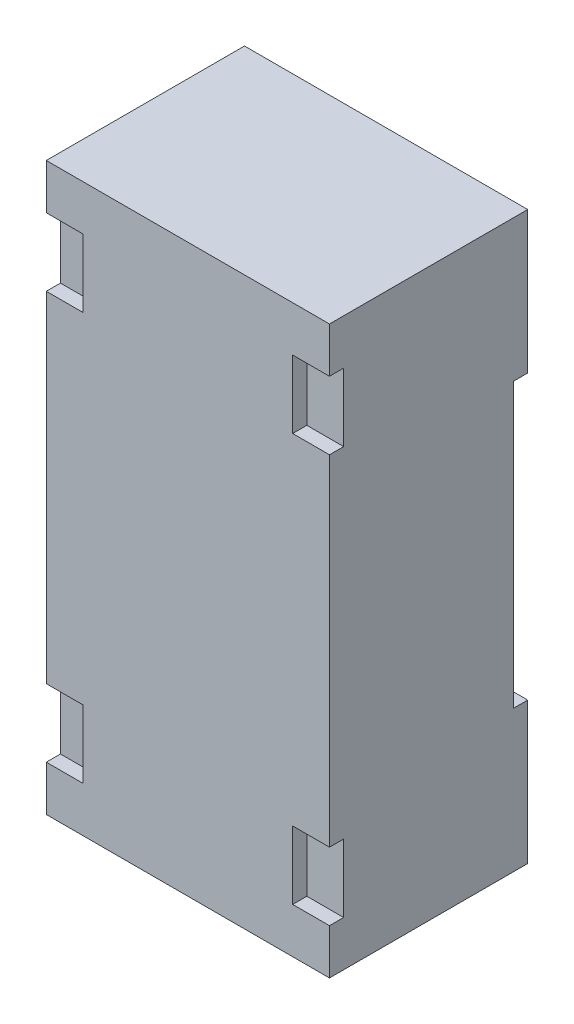
ISO-10303-21;
HEADER;
FILE_DESCRIPTION(('STEP AP214'),'2;1');
FILE_NAME('part.step','',(''),(''),'','','');
FILE_SCHEMA(('AUTOMOTIVE_DESIGN { 1 0 10303 214 1 1 1 1 }'));
ENDSEC;
DATA;
#1=APPLICATION_CONTEXT('core data for automotive mechanical design processes');
#2=APPLICATION_PROTOCOL_DEFINITION('international standard','automotive_design',2000,#1);
#3=PRODUCT_CONTEXT('',#1,'mechanical');
#4=PRODUCT('Part','Part','',(#3));
#5=PRODUCT_RELATED_PRODUCT_CATEGORY('part','',(#4));
#6=PRODUCT_DEFINITION_FORMATION('','',#4);
#7=PRODUCT_DEFINITION_CONTEXT('part definition',#1,'design');
#8=PRODUCT_DEFINITION('design','',#6,#7);
#9=PRODUCT_DEFINITION_SHAPE('','',#8);
#10=(LENGTH_UNIT() NAMED_UNIT(*) SI_UNIT(.MILLI.,.METRE.));
#11=(NAMED_UNIT(*) PLANE_ANGLE_UNIT() SI_UNIT($,.RADIAN.));
#12=(NAMED_UNIT(*) SI_UNIT($,.STERADIAN.) SOLID_ANGLE_UNIT());
#13=UNCERTAINTY_MEASURE_WITH_UNIT(LENGTH_MEASURE(1.E-05),#10,'distance_accuracy_value','');
#14=(GEOMETRIC_REPRESENTATION_CONTEXT(3) GLOBAL_UNCERTAINTY_ASSIGNED_CONTEXT((#13)) GLOBAL_UNIT_ASSIGNED_CONTEXT((#10,
#11,#12)) REPRESENTATION_CONTEXT('',''));
#15=CARTESIAN_POINT('',(0.,0.,0.));
#16=DIRECTION('',(0.,0.,1.));
#17=DIRECTION('',(1.,0.,0.));
#18=AXIS2_PLACEMENT_3D('',#15,#16,#17);
#19=CARTESIAN_POINT('',(14.117799072266,24.598000488281,1.501800003052));
#20=DIRECTION('',(0.,0.,-1.));
#21=DIRECTION('',(0.,-1.,0.));
#22=AXIS2_PLACEMENT_3D('',#19,#20,#21);
#23=PLANE('',#22);
#24=DIRECTION('',(0.,1.,0.));
#25=VECTOR('',#24,1.);
#26=CARTESIAN_POINT('',(14.617799072266,26.061125098144,1.501800003052));
#27=LINE('',#26,#25);
#28=CARTESIAN_POINT('',(14.617799072266,24.653000488281,1.501800003052));
#29=VERTEX_POINT('',#28);
#30=CARTESIAN_POINT('',(14.617799072266,24.773000488281,1.501800003052));
#31=VERTEX_POINT('',#30);
#32=EDGE_CURVE('E326',#29,#31,#27,.T.);
#33=ORIENTED_EDGE('',*,*,#32,.T.);
#34=DIRECTION('',(-1.,0.,0.));
#35=VECTOR('',#34,1.);
#36=CARTESIAN_POINT('',(14.617799072266,24.773000488281,1.501800003052));
#37=LINE('',#36,#35);
#38=CARTESIAN_POINT('',(14.552799072266,24.773000488281,1.501800003052));
#39=VERTEX_POINT('',#38);
#40=EDGE_CURVE('E247',#31,#39,#37,.T.);
#41=ORIENTED_EDGE('',*,*,#40,.T.);
#42=DIRECTION('',(0.,-1.,0.));
#43=VECTOR('',#42,1.);
#44=CARTESIAN_POINT('',(14.552799072266,24.773000488281,1.501800003052));
#45=LINE('',#44,#43);
#46=CARTESIAN_POINT('',(14.552799072266,24.653000488281,1.501800003052));
#47=VERTEX_POINT('',#46);
#48=EDGE_CURVE('E282',#39,#47,#45,.T.);
#49=ORIENTED_EDGE('',*,*,#48,.T.);
#50=DIRECTION('',(1.,0.,0.));
#51=VECTOR('',#50,1.);
#52=CARTESIAN_POINT('',(14.617799072266,24.653000488281,1.501800003052));
#53=LINE('',#52,#51);
#54=EDGE_CURVE('E274',#47,#29,#53,.T.);
#55=ORIENTED_EDGE('',*,*,#54,.T.);
#56=EDGE_LOOP('',(#33,#41,#49,#55));
#57=FACE_BOUND('',#56,.T.);
#58=ADVANCED_FACE('F17',(#57),#23,.F.);
#59=CARTESIAN_POINT('',(14.117799072266,24.598000488281,1.501800003052));
#60=DIRECTION('',(0.,0.,-1.));
#61=DIRECTION('',(0.,-1.,0.));
#62=AXIS2_PLACEMENT_3D('',#59,#60,#61);
#63=PLANE('',#62);
#64=DIRECTION('',(0.,1.,0.));
#65=VECTOR('',#64,1.);
#66=CARTESIAN_POINT('',(14.617799072266,26.061125098144,1.501800003052));
#67=LINE('',#66,#65);
#68=CARTESIAN_POINT('',(14.617799072266,25.373000488272,1.501800003052));
#69=VERTEX_POINT('',#68);
#70=CARTESIAN_POINT('',(14.617799072266,25.493000488281,1.501800003052));
#71=VERTEX_POINT('',#70);
#72=EDGE_CURVE('E334',#69,#71,#67,.T.);
#73=ORIENTED_EDGE('',*,*,#72,.T.);
#74=DIRECTION('',(-1.,0.,0.));
#75=VECTOR('',#74,1.);
#76=CARTESIAN_POINT('',(14.617799072266,25.493000488281,1.501800003052));
#77=LINE('',#76,#75);
#78=CARTESIAN_POINT('',(14.552799072266,25.493000488281,1.501800003052));
#79=VERTEX_POINT('',#78);
#80=EDGE_CURVE('E42',#71,#79,#77,.T.);
#81=ORIENTED_EDGE('',*,*,#80,.T.);
#82=DIRECTION('',(0.,-1.,0.));
#83=VECTOR('',#82,1.);
#84=CARTESIAN_POINT('',(14.552799072266,25.373000488281,1.501800003052));
#85=LINE('',#84,#83);
#86=CARTESIAN_POINT('',(14.552799072266,25.373000488277,1.501800003052));
#87=VERTEX_POINT('',#86);
#88=EDGE_CURVE('E377',#79,#87,#85,.T.);
#89=ORIENTED_EDGE('',*,*,#88,.T.);
#90=DIRECTION('',(-1.,0.,0.));
#91=VECTOR('',#90,1.);
#92=CARTESIAN_POINT('',(14.617799072266,25.373000488281,1.501800003052));
#93=LINE('',#92,#91);
#94=EDGE_CURVE('E289',#69,#87,#93,.T.);
#95=ORIENTED_EDGE('',*,*,#94,.F.);
#96=EDGE_LOOP('',(#73,#81,#89,#95));
#97=FACE_BOUND('',#96,.T.);
#98=ADVANCED_FACE('F587',(#97),#63,.F.);
#99=CARTESIAN_POINT('',(14.617799072266,25.573000488281,1.176800003052));
#100=DIRECTION('',(0.,0.,1.));
#101=DIRECTION('',(0.,-1.,0.));
#102=AXIS2_PLACEMENT_3D('',#99,#100,#101);
#103=PLANE('',#102);
#104=DIRECTION('',(0.,1.,0.));
#105=VECTOR('',#104,1.);
#106=CARTESIAN_POINT('',(14.117799072266,26.061125098144,1.176800003052));
#107=LINE('',#106,#105);
#108=CARTESIAN_POINT('',(14.117799072266,25.323000488281,1.176800003052));
#109=VERTEX_POINT('',#108);
#110=CARTESIAN_POINT('',(14.117799072266,25.573000488281,1.176800003052));
#111=VERTEX_POINT('',#110);
#112=EDGE_CURVE('E223',#109,#111,#107,.T.);
#113=ORIENTED_EDGE('',*,*,#112,.T.);
#114=DIRECTION('',(-1.,0.,0.));
#115=VECTOR('',#114,1.);
#116=CARTESIAN_POINT('',(14.617799072266,25.573000488281,1.176800003052));
#117=LINE('',#116,#115);
#118=CARTESIAN_POINT('',(14.617799072266,25.573000488281,1.176800003052));
#119=VERTEX_POINT('',#118);
#120=EDGE_CURVE('E118',#119,#111,#117,.T.);
#121=ORIENTED_EDGE('',*,*,#120,.F.);
#122=DIRECTION('',(0.,-1.,0.));
#123=VECTOR('',#122,1.);
#124=CARTESIAN_POINT('',(14.617799072266,26.061125098144,1.176800003052));
#125=LINE('',#124,#123);
#126=CARTESIAN_POINT('',(14.617799072266,25.323000488281,1.176800003052));
#127=VERTEX_POINT('',#126);
#128=EDGE_CURVE('E333',#119,#127,#125,.T.);
#129=ORIENTED_EDGE('',*,*,#128,.T.);
#130=DIRECTION('',(1.,0.,0.));
#131=VECTOR('',#130,1.);
#132=CARTESIAN_POINT('',(14.367799072266,25.323000488281,1.176800003052));
#133=LINE('',#132,#131);
#134=EDGE_CURVE('E133',#109,#127,#133,.T.);
#135=ORIENTED_EDGE('',*,*,#134,.F.);
#136=EDGE_LOOP('',(#113,#121,#129,#135));
#137=FACE_BOUND('',#136,.T.);
#138=ADVANCED_FACE('F224',(#137),#103,.F.);
#139=CARTESIAN_POINT('',(14.117799072266,24.598000488281,1.501800003052));
#140=DIRECTION('',(0.,0.,-1.));
#141=DIRECTION('',(0.,-1.,0.));
#142=AXIS2_PLACEMENT_3D('',#139,#140,#141);
#143=PLANE('',#142);
#144=DIRECTION('',(0.,1.,0.));
#145=VECTOR('',#144,1.);
#146=CARTESIAN_POINT('',(14.182799072266,24.773000488281,1.501800003052));
#147=LINE('',#146,#145);
#148=CARTESIAN_POINT('',(14.182799072266,24.653000488281,1.501800003052));
#149=VERTEX_POINT('',#148);
#150=CARTESIAN_POINT('',(14.182799072266,24.773000488281,1.501800003052));
#151=VERTEX_POINT('',#150);
#152=EDGE_CURVE('E258',#149,#151,#147,.T.);
#153=ORIENTED_EDGE('',*,*,#152,.T.);
#154=DIRECTION('',(-1.,0.,0.));
#155=VECTOR('',#154,1.);
#156=CARTESIAN_POINT('',(14.617799072266,24.773000488281,1.501800003052));
#157=LINE('',#156,#155);
#158=CARTESIAN_POINT('',(14.117799072266,24.773000488281,1.501800003052));
#159=VERTEX_POINT('',#158);
#160=EDGE_CURVE('E297',#151,#159,#157,.T.);
#161=ORIENTED_EDGE('',*,*,#160,.T.);
#162=DIRECTION('',(0.,-1.,0.));
#163=VECTOR('',#162,1.);
#164=CARTESIAN_POINT('',(14.117799072266,26.061125098144,1.501800003052));
#165=LINE('',#164,#163);
#166=CARTESIAN_POINT('',(14.117799072266,24.653000488281,1.501800003052));
#167=VERTEX_POINT('',#166);
#168=EDGE_CURVE('E396',#159,#167,#165,.T.);
#169=ORIENTED_EDGE('',*,*,#168,.T.);
#170=DIRECTION('',(1.,0.,0.));
#171=VECTOR('',#170,1.);
#172=CARTESIAN_POINT('',(14.117799072266,24.653000488281,1.501800003052));
#173=LINE('',#172,#171);
#174=EDGE_CURVE('E21',#167,#149,#173,.T.);
#175=ORIENTED_EDGE('',*,*,#174,.T.);
#176=EDGE_LOOP('',(#153,#161,#169,#175));
#177=FACE_BOUND('',#176,.T.);
#178=ADVANCED_FACE('F19',(#177),#143,.F.);
#179=CARTESIAN_POINT('',(14.617799072266,24.573000488281,1.176800003052));
#180=DIRECTION('',(0.,0.,1.));
#181=DIRECTION('',(1.,0.,0.));
#182=AXIS2_PLACEMENT_3D('',#179,#180,#181);
#183=PLANE('',#182);
#184=DIRECTION('',(0.,-1.,0.));
#185=VECTOR('',#184,1.);
#186=CARTESIAN_POINT('',(14.617799072266,26.061125098144,1.176800003052));
#187=LINE('',#186,#185);
#188=CARTESIAN_POINT('',(14.617799072266,24.823000488281,1.176800003052));
#189=VERTEX_POINT('',#188);
#190=CARTESIAN_POINT('',(14.617799072266,24.573000488281,1.176800003052));
#191=VERTEX_POINT('',#190);
#192=EDGE_CURVE('E253',#189,#191,#187,.T.);
#193=ORIENTED_EDGE('',*,*,#192,.T.);
#194=DIRECTION('',(1.,0.,0.));
#195=VECTOR('',#194,1.);
#196=CARTESIAN_POINT('',(14.617799072266,24.573000488281,1.176800003052));
#197=LINE('',#196,#195);
#198=CARTESIAN_POINT('',(14.117799072266,24.573000488281,1.176800003052));
#199=VERTEX_POINT('',#198);
#200=EDGE_CURVE('E420',#199,#191,#197,.T.);
#201=ORIENTED_EDGE('',*,*,#200,.F.);
#202=DIRECTION('',(0.,1.,0.));
#203=VECTOR('',#202,1.);
#204=CARTESIAN_POINT('',(14.117799072266,26.061125098144,1.176800003052));
#205=LINE('',#204,#203);
#206=CARTESIAN_POINT('',(14.117799072266,24.823000488281,1.176800003052));
#207=VERTEX_POINT('',#206);
#208=EDGE_CURVE('E321',#199,#207,#205,.T.);
#209=ORIENTED_EDGE('',*,*,#208,.T.);
#210=DIRECTION('',(-1.,0.,0.));
#211=VECTOR('',#210,1.);
#212=CARTESIAN_POINT('',(14.367799072266,24.823000488281,1.176800003052));
#213=LINE('',#212,#211);
#214=EDGE_CURVE('E11',#189,#207,#213,.T.);
#215=ORIENTED_EDGE('',*,*,#214,.F.);
#216=EDGE_LOOP('',(#193,#201,#209,#215));
#217=FACE_BOUND('',#216,.T.);
#218=ADVANCED_FACE('F555',(#217),#183,.F.);
#219=CARTESIAN_POINT('',(14.367799072266,24.823000488281,1.189300003052));
#220=DIRECTION('',(0.,1.,0.));
#221=DIRECTION('',(1.,0.,0.));
#222=AXIS2_PLACEMENT_3D('',#219,#220,#221);
#223=PLANE('',#222);
#224=DIRECTION('',(0.,0.,1.));
#225=VECTOR('',#224,1.);
#226=CARTESIAN_POINT('',(14.117799072266,24.823000488281,1.526800003052));
#227=LINE('',#226,#225);
#228=CARTESIAN_POINT('',(14.117799072266,24.823000488281,1.201800003052));
#229=VERTEX_POINT('',#228);
#230=EDGE_CURVE('E310',#207,#229,#227,.T.);
#231=ORIENTED_EDGE('',*,*,#230,.T.);
#232=DIRECTION('',(1.,0.,0.));
#233=VECTOR('',#232,1.);
#234=CARTESIAN_POINT('',(14.117799072266,24.823000488281,1.201800003052));
#235=LINE('',#234,#233);
#236=CARTESIAN_POINT('',(14.617799072266,24.823000488281,1.201800003052));
#237=VERTEX_POINT('',#236);
#238=EDGE_CURVE('E28',#229,#237,#235,.T.);
#239=ORIENTED_EDGE('',*,*,#238,.T.);
#240=DIRECTION('',(0.,0.,-1.));
#241=VECTOR('',#240,1.);
#242=CARTESIAN_POINT('',(14.617799072266,24.823000488281,1.501800003052));
#243=LINE('',#242,#241);
#244=EDGE_CURVE('E248',#237,#189,#243,.T.);
#245=ORIENTED_EDGE('',*,*,#244,.T.);
#246=ORIENTED_EDGE('',*,*,#214,.T.);
#247=EDGE_LOOP('',(#231,#239,#245,#246));
#248=FACE_BOUND('',#247,.T.);
#249=ADVANCED_FACE('F551',(#248),#223,.T.);
#250=CARTESIAN_POINT('',(14.117799072266,24.598000488281,1.201800003052));
#251=DIRECTION('',(0.,0.,1.));
#252=DIRECTION('',(1.,0.,0.));
#253=AXIS2_PLACEMENT_3D('',#250,#251,#252);
#254=PLANE('',#253);
#255=DIRECTION('',(0.,1.,0.));
#256=VECTOR('',#255,1.);
#257=CARTESIAN_POINT('',(14.117799072266,26.061125098144,1.201800003052));
#258=LINE('',#257,#256);
#259=CARTESIAN_POINT('',(14.117799072266,25.323000488281,1.201800003052));
#260=VERTEX_POINT('',#259);
#261=EDGE_CURVE('E306',#229,#260,#258,.T.);
#262=ORIENTED_EDGE('',*,*,#261,.T.);
#263=DIRECTION('',(-1.,0.,0.));
#264=VECTOR('',#263,1.);
#265=CARTESIAN_POINT('',(14.367799072266,25.323000488281,1.201800003052));
#266=LINE('',#265,#264);
#267=CARTESIAN_POINT('',(14.617799072266,25.323000488281,1.201800003052));
#268=VERTEX_POINT('',#267);
#269=EDGE_CURVE('E256',#268,#260,#266,.T.);
#270=ORIENTED_EDGE('',*,*,#269,.F.);
#271=DIRECTION('',(0.,-1.,0.));
#272=VECTOR('',#271,1.);
#273=CARTESIAN_POINT('',(14.617799072266,26.061125098144,1.201800003052));
#274=LINE('',#273,#272);
#275=EDGE_CURVE('E252',#268,#237,#274,.T.);
#276=ORIENTED_EDGE('',*,*,#275,.T.);
#277=ORIENTED_EDGE('',*,*,#238,.F.);
#278=EDGE_LOOP('',(#262,#270,#276,#277));
#279=FACE_BOUND('',#278,.T.);
#280=ADVANCED_FACE('F549',(#279),#254,.F.);
#281=CARTESIAN_POINT('',(14.367799072266,25.323000488281,1.189300003052));
#282=DIRECTION('',(0.,-1.,0.));
#283=DIRECTION('',(-1.,0.,0.));
#284=AXIS2_PLACEMENT_3D('',#281,#282,#283);
#285=PLANE('',#284);
#286=DIRECTION('',(0.,0.,-1.));
#287=VECTOR('',#286,1.);
#288=CARTESIAN_POINT('',(14.117799072266,25.323000488281,1.526800003052));
#289=LINE('',#288,#287);
#290=EDGE_CURVE('E228',#260,#109,#289,.T.);
#291=ORIENTED_EDGE('',*,*,#290,.T.);
#292=ORIENTED_EDGE('',*,*,#134,.T.);
#293=DIRECTION('',(0.,0.,1.));
#294=VECTOR('',#293,1.);
#295=CARTESIAN_POINT('',(14.617799072266,25.323000488281,1.501800003052));
#296=LINE('',#295,#294);
#297=EDGE_CURVE('E301',#127,#268,#296,.T.);
#298=ORIENTED_EDGE('',*,*,#297,.T.);
#299=ORIENTED_EDGE('',*,*,#269,.T.);
#300=EDGE_LOOP('',(#291,#292,#298,#299));
#301=FACE_BOUND('',#300,.T.);
#302=ADVANCED_FACE('F546',(#301),#285,.T.);
#303=CARTESIAN_POINT('',(14.117799072266,24.598000488281,1.501800003052));
#304=DIRECTION('',(0.,0.,-1.));
#305=DIRECTION('',(0.,-1.,0.));
#306=AXIS2_PLACEMENT_3D('',#303,#304,#305);
#307=PLANE('',#306);
#308=DIRECTION('',(0.,1.,0.));
#309=VECTOR('',#308,1.);
#310=CARTESIAN_POINT('',(14.182799072266,25.373000488281,1.501800003052));
#311=LINE('',#310,#309);
#312=CARTESIAN_POINT('',(14.182799072266,25.373000488281,1.501800003052));
#313=VERTEX_POINT('',#312);
#314=CARTESIAN_POINT('',(14.182799072266,25.493000488281,1.501800003052));
#315=VERTEX_POINT('',#314);
#316=EDGE_CURVE('E266',#313,#315,#311,.T.);
#317=ORIENTED_EDGE('',*,*,#316,.T.);
#318=DIRECTION('',(-1.,0.,0.));
#319=VECTOR('',#318,1.);
#320=CARTESIAN_POINT('',(14.117799072266,25.493000488281,1.501800003052));
#321=LINE('',#320,#319);
#322=CARTESIAN_POINT('',(14.117799072266,25.493000488281,1.501800003052));
#323=VERTEX_POINT('',#322);
#324=EDGE_CURVE('E220',#315,#323,#321,.T.);
#325=ORIENTED_EDGE('',*,*,#324,.T.);
#326=DIRECTION('',(0.,-1.,0.));
#327=VECTOR('',#326,1.);
#328=CARTESIAN_POINT('',(14.117799072266,26.061125098144,1.501800003052));
#329=LINE('',#328,#327);
#330=CARTESIAN_POINT('',(14.117799072266,25.373000488277,1.501800003052));
#331=VERTEX_POINT('',#330);
#332=EDGE_CURVE('E243',#323,#331,#329,.T.);
#333=ORIENTED_EDGE('',*,*,#332,.T.);
#334=DIRECTION('',(-1.,0.,0.));
#335=VECTOR('',#334,1.);
#336=CARTESIAN_POINT('',(14.617799072266,25.373000488281,1.501800003052));
#337=LINE('',#336,#335);
#338=EDGE_CURVE('E311',#313,#331,#337,.T.);
#339=ORIENTED_EDGE('',*,*,#338,.F.);
#340=EDGE_LOOP('',(#317,#325,#333,#339));
#341=FACE_BOUND('',#340,.T.);
#342=ADVANCED_FACE('F533',(#341),#307,.F.);
#343=CARTESIAN_POINT('',(14.117799072266,25.493000488281,1.501800003052));
#344=DIRECTION('',(0.,1.,0.));
#345=DIRECTION('',(0.,0.,-1.));
#346=AXIS2_PLACEMENT_3D('',#343,#344,#345);
#347=PLANE('',#346);
#348=DIRECTION('',(0.,0.,-1.));
#349=VECTOR('',#348,1.);
#350=CARTESIAN_POINT('',(14.117799072266,25.493000488281,1.526800003052));
#351=LINE('',#350,#349);
#352=CARTESIAN_POINT('',(14.117799072266,25.493000488281,1.526800003052));
#353=VERTEX_POINT('',#352);
#354=EDGE_CURVE('E236',#353,#323,#351,.T.);
#355=ORIENTED_EDGE('',*,*,#354,.T.);
#356=ORIENTED_EDGE('',*,*,#324,.F.);
#357=DIRECTION('',(0.,0.,1.));
#358=VECTOR('',#357,1.);
#359=CARTESIAN_POINT('',(14.182799072266,25.493000488281,1.501800003052));
#360=LINE('',#359,#358);
#361=CARTESIAN_POINT('',(14.182799072266,25.493000488281,1.526800003052));
#362=VERTEX_POINT('',#361);
#363=EDGE_CURVE('E263',#315,#362,#360,.T.);
#364=ORIENTED_EDGE('',*,*,#363,.T.);
#365=DIRECTION('',(-1.,0.,0.));
#366=VECTOR('',#365,1.);
#367=CARTESIAN_POINT('',(14.617799072266,25.493000488281,1.526800003052));
#368=LINE('',#367,#366);
#369=EDGE_CURVE('E305',#362,#353,#368,.T.);
#370=ORIENTED_EDGE('',*,*,#369,.T.);
#371=EDGE_LOOP('',(#355,#356,#364,#370));
#372=FACE_BOUND('',#371,.T.);
#373=ADVANCED_FACE('F535',(#372),#347,.F.);
#374=CARTESIAN_POINT('',(14.617799072266,25.573000488281,1.526800003052));
#375=DIRECTION('',(0.,1.,0.));
#376=DIRECTION('',(0.,0.,-1.));
#377=AXIS2_PLACEMENT_3D('',#374,#375,#376);
#378=PLANE('',#377);
#379=DIRECTION('',(0.,0.,-1.));
#380=VECTOR('',#379,1.);
#381=CARTESIAN_POINT('',(14.617799072266,25.573000488281,1.501800003052));
#382=LINE('',#381,#380);
#383=CARTESIAN_POINT('',(14.617799072266,25.573000488281,1.526800003052));
#384=VERTEX_POINT('',#383);
#385=EDGE_CURVE('E217',#384,#119,#382,.T.);
#386=ORIENTED_EDGE('',*,*,#385,.T.);
#387=ORIENTED_EDGE('',*,*,#120,.T.);
#388=DIRECTION('',(0.,0.,1.));
#389=VECTOR('',#388,1.);
#390=CARTESIAN_POINT('',(14.117799072266,25.573000488281,1.526800003052));
#391=LINE('',#390,#389);
#392=CARTESIAN_POINT('',(14.117799072266,25.573000488281,1.526800003052));
#393=VERTEX_POINT('',#392);
#394=EDGE_CURVE('E215',#111,#393,#391,.T.);
#395=ORIENTED_EDGE('',*,*,#394,.T.);
#396=DIRECTION('',(1.,0.,0.));
#397=VECTOR('',#396,1.);
#398=CARTESIAN_POINT('',(14.617799072266,25.573000488281,1.526800003052));
#399=LINE('',#398,#397);
#400=EDGE_CURVE('E369',#393,#384,#399,.T.);
#401=ORIENTED_EDGE('',*,*,#400,.T.);
#402=EDGE_LOOP('',(#386,#387,#395,#401));
#403=FACE_BOUND('',#402,.T.);
#404=ADVANCED_FACE('F212',(#403),#378,.T.);
#405=CARTESIAN_POINT('',(14.617799072266,25.493000488281,1.501800003052));
#406=DIRECTION('',(0.,1.,0.));
#407=DIRECTION('',(0.,0.,-1.));
#408=AXIS2_PLACEMENT_3D('',#405,#406,#407);
#409=PLANE('',#408);
#410=DIRECTION('',(0.,0.,-1.));
#411=VECTOR('',#410,1.);
#412=CARTESIAN_POINT('',(14.552799072266,25.493000488281,1.501800003052));
#413=LINE('',#412,#411);
#414=CARTESIAN_POINT('',(14.552799072266,25.493000488281,1.526800003052));
#415=VERTEX_POINT('',#414);
#416=EDGE_CURVE('E380',#415,#79,#413,.T.);
#417=ORIENTED_EDGE('',*,*,#416,.T.);
#418=ORIENTED_EDGE('',*,*,#80,.F.);
#419=DIRECTION('',(0.,0.,1.));
#420=VECTOR('',#419,1.);
#421=CARTESIAN_POINT('',(14.617799072266,25.493000488281,1.501800003052));
#422=LINE('',#421,#420);
#423=CARTESIAN_POINT('',(14.617799072266,25.493000488281,1.526800003052));
#424=VERTEX_POINT('',#423);
#425=EDGE_CURVE('E338',#71,#424,#422,.T.);
#426=ORIENTED_EDGE('',*,*,#425,.T.);
#427=DIRECTION('',(-1.,0.,0.));
#428=VECTOR('',#427,1.);
#429=CARTESIAN_POINT('',(14.617799072266,25.493000488281,1.526800003052));
#430=LINE('',#429,#428);
#431=EDGE_CURVE('E287',#424,#415,#430,.T.);
#432=ORIENTED_EDGE('',*,*,#431,.T.);
#433=EDGE_LOOP('',(#417,#418,#426,#432));
#434=FACE_BOUND('',#433,.T.);
#435=ADVANCED_FACE('F622',(#434),#409,.F.);
#436=CARTESIAN_POINT('',(14.552799072266,25.373000488281,1.501800003052));
#437=DIRECTION('',(-1.,0.,0.));
#438=DIRECTION('',(0.,0.,1.));
#439=AXIS2_PLACEMENT_3D('',#436,#437,#438);
#440=PLANE('',#439);
#441=DIRECTION('',(0.,0.,1.));
#442=VECTOR('',#441,1.);
#443=CARTESIAN_POINT('',(14.552799072266,25.373000488281,1.526800003052));
#444=LINE('',#443,#442);
#445=CARTESIAN_POINT('',(14.552799072266,25.373000488281,1.526800003052));
#446=VERTEX_POINT('',#445);
#447=EDGE_CURVE('E292',#87,#446,#444,.T.);
#448=ORIENTED_EDGE('',*,*,#447,.F.);
#449=ORIENTED_EDGE('',*,*,#88,.F.);
#450=ORIENTED_EDGE('',*,*,#416,.F.);
#451=DIRECTION('',(0.,-1.,0.));
#452=VECTOR('',#451,1.);
#453=CARTESIAN_POINT('',(14.552799072266,26.061125098144,1.526800003052));
#454=LINE('',#453,#452);
#455=EDGE_CURVE('E283',#415,#446,#454,.T.);
#456=ORIENTED_EDGE('',*,*,#455,.T.);
#457=EDGE_LOOP('',(#448,#449,#450,#456));
#458=FACE_BOUND('',#457,.T.);
#459=ADVANCED_FACE('F618',(#458),#440,.F.);
#460=CARTESIAN_POINT('',(14.617799072266,25.373000488281,1.526800003052));
#461=DIRECTION('',(0.,1.,0.));
#462=DIRECTION('',(0.,0.,-1.));
#463=AXIS2_PLACEMENT_3D('',#460,#461,#462);
#464=PLANE('',#463);
#465=DIRECTION('',(0.,0.,-1.));
#466=VECTOR('',#465,1.);
#467=CARTESIAN_POINT('',(14.617799072266,25.373000488263,1.501800003052));
#468=LINE('',#467,#466);
#469=CARTESIAN_POINT('',(14.617799072266,25.373000488277,1.526800003052));
#470=VERTEX_POINT('',#469);
#471=EDGE_CURVE('E337',#470,#69,#468,.T.);
#472=ORIENTED_EDGE('',*,*,#471,.T.);
#473=ORIENTED_EDGE('',*,*,#94,.T.);
#474=ORIENTED_EDGE('',*,*,#447,.T.);
#475=DIRECTION('',(1.,0.,0.));
#476=VECTOR('',#475,1.);
#477=CARTESIAN_POINT('',(14.617799072266,25.373000488281,1.526800003052));
#478=LINE('',#477,#476);
#479=EDGE_CURVE('E288',#446,#470,#478,.T.);
#480=ORIENTED_EDGE('',*,*,#479,.T.);
#481=EDGE_LOOP('',(#472,#473,#474,#480));
#482=FACE_BOUND('',#481,.T.);
#483=ADVANCED_FACE('F621',(#482),#464,.T.);
#484=CARTESIAN_POINT('',(14.617799072266,24.773000488281,1.501800003052));
#485=DIRECTION('',(0.,1.,0.));
#486=DIRECTION('',(1.,0.,0.));
#487=AXIS2_PLACEMENT_3D('',#484,#485,#486);
#488=PLANE('',#487);
#489=ORIENTED_EDGE('',*,*,#40,.F.);
#490=DIRECTION('',(0.,0.,1.));
#491=VECTOR('',#490,1.);
#492=CARTESIAN_POINT('',(14.617799072266,24.773000488281,1.501800003052));
#493=LINE('',#492,#491);
#494=CARTESIAN_POINT('',(14.617799072266,24.773000488281,1.526800003052));
#495=VERTEX_POINT('',#494);
#496=EDGE_CURVE('E429',#31,#495,#493,.T.);
#497=ORIENTED_EDGE('',*,*,#496,.T.);
#498=DIRECTION('',(-1.,0.,0.));
#499=VECTOR('',#498,1.);
#500=CARTESIAN_POINT('',(14.617799072266,24.773000488281,1.526800003052));
#501=LINE('',#500,#499);
#502=CARTESIAN_POINT('',(14.552799072266,24.773000488281,1.526800003052));
#503=VERTEX_POINT('',#502);
#504=EDGE_CURVE('E384',#495,#503,#501,.T.);
#505=ORIENTED_EDGE('',*,*,#504,.T.);
#506=DIRECTION('',(0.,0.,-1.));
#507=VECTOR('',#506,1.);
#508=CARTESIAN_POINT('',(14.552799072266,24.773000488281,1.501800003052));
#509=LINE('',#508,#507);
#510=EDGE_CURVE('E278',#503,#39,#509,.T.);
#511=ORIENTED_EDGE('',*,*,#510,.T.);
#512=EDGE_LOOP('',(#489,#497,#505,#511));
#513=FACE_BOUND('',#512,.T.);
#514=ADVANCED_FACE('F492',(#513),#488,.F.);
#515=CARTESIAN_POINT('',(14.552799072266,24.773000488281,1.501800003052));
#516=DIRECTION('',(-1.,0.,0.));
#517=DIRECTION('',(0.,1.,0.));
#518=AXIS2_PLACEMENT_3D('',#515,#516,#517);
#519=PLANE('',#518);
#520=DIRECTION('',(0.,0.,-1.));
#521=VECTOR('',#520,1.);
#522=CARTESIAN_POINT('',(14.552799072266,24.653000488281,1.501800003052));
#523=LINE('',#522,#521);
#524=CARTESIAN_POINT('',(14.552799072266,24.653000488281,1.526800003052));
#525=VERTEX_POINT('',#524);
#526=EDGE_CURVE('E277',#525,#47,#523,.T.);
#527=ORIENTED_EDGE('',*,*,#526,.T.);
#528=ORIENTED_EDGE('',*,*,#48,.F.);
#529=ORIENTED_EDGE('',*,*,#510,.F.);
#530=DIRECTION('',(0.,-1.,0.));
#531=VECTOR('',#530,1.);
#532=CARTESIAN_POINT('',(14.552799072266,26.061125098144,1.526800003052));
#533=LINE('',#532,#531);
#534=EDGE_CURVE('E346',#503,#525,#533,.T.);
#535=ORIENTED_EDGE('',*,*,#534,.T.);
#536=EDGE_LOOP('',(#527,#528,#529,#535));
#537=FACE_BOUND('',#536,.T.);
#538=ADVANCED_FACE('F481',(#537),#519,.F.);
#539=CARTESIAN_POINT('',(14.617799072266,24.653000488281,1.501800003052));
#540=DIRECTION('',(0.,-1.,0.));
#541=DIRECTION('',(0.,0.,-1.));
#542=AXIS2_PLACEMENT_3D('',#539,#540,#541);
#543=PLANE('',#542);
#544=DIRECTION('',(0.,0.,-1.));
#545=VECTOR('',#544,1.);
#546=CARTESIAN_POINT('',(14.617799072266,24.653000488281,1.501800003052));
#547=LINE('',#546,#545);
#548=CARTESIAN_POINT('',(14.617799072266,24.653000488281,1.526800003052));
#549=VERTEX_POINT('',#548);
#550=EDGE_CURVE('E322',#549,#29,#547,.T.);
#551=ORIENTED_EDGE('',*,*,#550,.T.);
#552=ORIENTED_EDGE('',*,*,#54,.F.);
#553=ORIENTED_EDGE('',*,*,#526,.F.);
#554=DIRECTION('',(1.,0.,0.));
#555=VECTOR('',#554,1.);
#556=CARTESIAN_POINT('',(14.617799072266,24.653000488281,1.526800003052));
#557=LINE('',#556,#555);
#558=EDGE_CURVE('E272',#525,#549,#557,.T.);
#559=ORIENTED_EDGE('',*,*,#558,.T.);
#560=EDGE_LOOP('',(#551,#552,#553,#559));
#561=FACE_BOUND('',#560,.T.);
#562=ADVANCED_FACE('F485',(#561),#543,.F.);
#563=CARTESIAN_POINT('',(14.617799072266,26.061125098144,1.501800003052));
#564=DIRECTION('',(-1.,0.,0.));
#565=DIRECTION('',(0.,0.,1.));
#566=AXIS2_PLACEMENT_3D('',#563,#564,#565);
#567=PLANE('',#566);
#568=ORIENTED_EDGE('',*,*,#425,.F.);
#569=ORIENTED_EDGE('',*,*,#72,.F.);
#570=ORIENTED_EDGE('',*,*,#471,.F.);
#571=DIRECTION('',(0.,-1.,0.));
#572=VECTOR('',#571,1.);
#573=CARTESIAN_POINT('',(14.617799072266,26.061125098144,1.526800003052));
#574=LINE('',#573,#572);
#575=EDGE_CURVE('E388',#470,#495,#574,.T.);
#576=ORIENTED_EDGE('',*,*,#575,.T.);
#577=ORIENTED_EDGE('',*,*,#496,.F.);
#578=ORIENTED_EDGE('',*,*,#32,.F.);
#579=ORIENTED_EDGE('',*,*,#550,.F.);
#580=DIRECTION('',(0.,-1.,0.));
#581=VECTOR('',#580,1.);
#582=CARTESIAN_POINT('',(14.617799072266,26.061125098144,1.526800003052));
#583=LINE('',#582,#581);
#584=CARTESIAN_POINT('',(14.617799072266,24.573000488281,1.526800003052));
#585=VERTEX_POINT('',#584);
#586=EDGE_CURVE('E268',#549,#585,#583,.T.);
#587=ORIENTED_EDGE('',*,*,#586,.T.);
#588=DIRECTION('',(0.,0.,1.));
#589=VECTOR('',#588,1.);
#590=CARTESIAN_POINT('',(14.617799072266,24.573000488281,1.526800003052));
#591=LINE('',#590,#589);
#592=EDGE_CURVE('E417',#191,#585,#591,.T.);
#593=ORIENTED_EDGE('',*,*,#592,.F.);
#594=ORIENTED_EDGE('',*,*,#192,.F.);
#595=ORIENTED_EDGE('',*,*,#244,.F.);
#596=ORIENTED_EDGE('',*,*,#275,.F.);
#597=ORIENTED_EDGE('',*,*,#297,.F.);
#598=ORIENTED_EDGE('',*,*,#128,.F.);
#599=ORIENTED_EDGE('',*,*,#385,.F.);
#600=DIRECTION('',(0.,-1.,0.));
#601=VECTOR('',#600,1.);
#602=CARTESIAN_POINT('',(14.617799072266,26.061125098144,1.526800003052));
#603=LINE('',#602,#601);
#604=EDGE_CURVE('E414',#384,#424,#603,.T.);
#605=ORIENTED_EDGE('',*,*,#604,.T.);
#606=EDGE_LOOP('',(#568,#569,#570,#576,#577,#578,#579,#587,#593,#594,#595,#596,#597,#598,#599,#605));
#607=FACE_BOUND('',#606,.T.);
#608=ADVANCED_FACE('F541',(#607),#567,.F.);
#609=CARTESIAN_POINT('',(14.617799072266,24.573000488281,1.526800003052));
#610=DIRECTION('',(0.,-1.,0.));
#611=DIRECTION('',(-1.,0.,0.));
#612=AXIS2_PLACEMENT_3D('',#609,#610,#611);
#613=PLANE('',#612);
#614=ORIENTED_EDGE('',*,*,#592,.T.);
#615=DIRECTION('',(-1.,0.,0.));
#616=VECTOR('',#615,1.);
#617=CARTESIAN_POINT('',(14.617799072266,24.573000488281,1.526800003052));
#618=LINE('',#617,#616);
#619=CARTESIAN_POINT('',(14.117799072266,24.573000488281,1.526800003052));
#620=VERTEX_POINT('',#619);
#621=EDGE_CURVE('E273',#585,#620,#618,.T.);
#622=ORIENTED_EDGE('',*,*,#621,.T.);
#623=DIRECTION('',(0.,0.,-1.));
#624=VECTOR('',#623,1.);
#625=CARTESIAN_POINT('',(14.117799072266,24.573000488281,1.526800003052));
#626=LINE('',#625,#624);
#627=EDGE_CURVE('E347',#620,#199,#626,.T.);
#628=ORIENTED_EDGE('',*,*,#627,.T.);
#629=ORIENTED_EDGE('',*,*,#200,.T.);
#630=EDGE_LOOP('',(#614,#622,#628,#629));
#631=FACE_BOUND('',#630,.T.);
#632=ADVANCED_FACE('F559',(#631),#613,.T.);
#633=CARTESIAN_POINT('',(14.117799072266,24.653000488281,1.501800003052));
#634=DIRECTION('',(0.,-1.,0.));
#635=DIRECTION('',(0.,0.,-1.));
#636=AXIS2_PLACEMENT_3D('',#633,#634,#635);
#637=PLANE('',#636);
#638=DIRECTION('',(0.,0.,-1.));
#639=VECTOR('',#638,1.);
#640=CARTESIAN_POINT('',(14.182799072266,24.653000488281,1.501800003052));
#641=LINE('',#640,#639);
#642=CARTESIAN_POINT('',(14.182799072266,24.653000488281,1.526800003052));
#643=VERTEX_POINT('',#642);
#644=EDGE_CURVE('E261',#643,#149,#641,.T.);
#645=ORIENTED_EDGE('',*,*,#644,.T.);
#646=ORIENTED_EDGE('',*,*,#174,.F.);
#647=DIRECTION('',(0.,0.,1.));
#648=VECTOR('',#647,1.);
#649=CARTESIAN_POINT('',(14.117799072266,24.653000488281,1.526800003052));
#650=LINE('',#649,#648);
#651=CARTESIAN_POINT('',(14.117799072266,24.653000488281,1.526800003052));
#652=VERTEX_POINT('',#651);
#653=EDGE_CURVE('E351',#167,#652,#650,.T.);
#654=ORIENTED_EDGE('',*,*,#653,.T.);
#655=DIRECTION('',(1.,0.,0.));
#656=VECTOR('',#655,1.);
#657=CARTESIAN_POINT('',(14.617799072266,24.653000488281,1.526800003052));
#658=LINE('',#657,#656);
#659=EDGE_CURVE('E373',#652,#643,#658,.T.);
#660=ORIENTED_EDGE('',*,*,#659,.T.);
#661=EDGE_LOOP('',(#645,#646,#654,#660));
#662=FACE_BOUND('',#661,.T.);
#663=ADVANCED_FACE('F565',(#662),#637,.F.);
#664=CARTESIAN_POINT('',(14.182799072266,24.773000488281,1.501800003052));
#665=DIRECTION('',(1.,0.,0.));
#666=DIRECTION('',(0.,-1.,0.));
#667=AXIS2_PLACEMENT_3D('',#664,#665,#666);
#668=PLANE('',#667);
#669=DIRECTION('',(0.,0.,-1.));
#670=VECTOR('',#669,1.);
#671=CARTESIAN_POINT('',(14.182799072266,24.773000488281,1.501800003052));
#672=LINE('',#671,#670);
#673=CARTESIAN_POINT('',(14.182799072266,24.773000488281,1.526800003052));
#674=VERTEX_POINT('',#673);
#675=EDGE_CURVE('E262',#674,#151,#672,.T.);
#676=ORIENTED_EDGE('',*,*,#675,.T.);
#677=ORIENTED_EDGE('',*,*,#152,.F.);
#678=ORIENTED_EDGE('',*,*,#644,.F.);
#679=DIRECTION('',(0.,1.,0.));
#680=VECTOR('',#679,1.);
#681=CARTESIAN_POINT('',(14.182799072266,26.061125098144,1.526800003052));
#682=LINE('',#681,#680);
#683=EDGE_CURVE('E316',#643,#674,#682,.T.);
#684=ORIENTED_EDGE('',*,*,#683,.T.);
#685=EDGE_LOOP('',(#676,#677,#678,#684));
#686=FACE_BOUND('',#685,.T.);
#687=ADVANCED_FACE('F573',(#686),#668,.F.);
#688=CARTESIAN_POINT('',(14.617799072266,24.773000488281,1.501800003052));
#689=DIRECTION('',(0.,1.,0.));
#690=DIRECTION('',(1.,0.,0.));
#691=AXIS2_PLACEMENT_3D('',#688,#689,#690);
#692=PLANE('',#691);
#693=DIRECTION('',(-1.,0.,0.));
#694=VECTOR('',#693,1.);
#695=CARTESIAN_POINT('',(14.617799072266,24.773000488281,1.526800003052));
#696=LINE('',#695,#694);
#697=CARTESIAN_POINT('',(14.117799072266,24.773000488281,1.526800003052));
#698=VERTEX_POINT('',#697);
#699=EDGE_CURVE('E312',#674,#698,#696,.T.);
#700=ORIENTED_EDGE('',*,*,#699,.T.);
#701=DIRECTION('',(0.,0.,-1.));
#702=VECTOR('',#701,1.);
#703=CARTESIAN_POINT('',(14.117799072266,24.773000488281,1.526800003052));
#704=LINE('',#703,#702);
#705=EDGE_CURVE('E391',#698,#159,#704,.T.);
#706=ORIENTED_EDGE('',*,*,#705,.T.);
#707=ORIENTED_EDGE('',*,*,#160,.F.);
#708=ORIENTED_EDGE('',*,*,#675,.F.);
#709=EDGE_LOOP('',(#700,#706,#707,#708));
#710=FACE_BOUND('',#709,.T.);
#711=ADVANCED_FACE('F571',(#710),#692,.F.);
#712=CARTESIAN_POINT('',(14.117799072266,26.061125098144,1.526800003052));
#713=DIRECTION('',(1.,0.,0.));
#714=DIRECTION('',(0.,0.,1.));
#715=AXIS2_PLACEMENT_3D('',#712,#713,#714);
#716=PLANE('',#715);
#717=ORIENTED_EDGE('',*,*,#261,.F.);
#718=ORIENTED_EDGE('',*,*,#230,.F.);
#719=ORIENTED_EDGE('',*,*,#208,.F.);
#720=ORIENTED_EDGE('',*,*,#627,.F.);
#721=DIRECTION('',(0.,1.,0.));
#722=VECTOR('',#721,1.);
#723=CARTESIAN_POINT('',(14.117799072266,26.061125098144,1.526800003052));
#724=LINE('',#723,#722);
#725=EDGE_CURVE('E445',#620,#652,#724,.T.);
#726=ORIENTED_EDGE('',*,*,#725,.T.);
#727=ORIENTED_EDGE('',*,*,#653,.F.);
#728=ORIENTED_EDGE('',*,*,#168,.F.);
#729=ORIENTED_EDGE('',*,*,#705,.F.);
#730=DIRECTION('',(0.,1.,0.));
#731=VECTOR('',#730,1.);
#732=CARTESIAN_POINT('',(14.117799072266,26.061125098144,1.526800003052));
#733=LINE('',#732,#731);
#734=CARTESIAN_POINT('',(14.117799072266,25.373000488267,1.526800003052));
#735=VERTEX_POINT('',#734);
#736=EDGE_CURVE('E317',#698,#735,#733,.T.);
#737=ORIENTED_EDGE('',*,*,#736,.T.);
#738=DIRECTION('',(0.,0.,1.));
#739=VECTOR('',#738,1.);
#740=CARTESIAN_POINT('',(14.117799072266,25.373000488281,1.526800003052));
#741=LINE('',#740,#739);
#742=EDGE_CURVE('E363',#331,#735,#741,.T.);
#743=ORIENTED_EDGE('',*,*,#742,.F.);
#744=ORIENTED_EDGE('',*,*,#332,.F.);
#745=ORIENTED_EDGE('',*,*,#354,.F.);
#746=DIRECTION('',(0.,1.,0.));
#747=VECTOR('',#746,1.);
#748=CARTESIAN_POINT('',(14.117799072266,26.061125098144,1.526800003052));
#749=LINE('',#748,#747);
#750=EDGE_CURVE('E233',#353,#393,#749,.T.);
#751=ORIENTED_EDGE('',*,*,#750,.T.);
#752=ORIENTED_EDGE('',*,*,#394,.F.);
#753=ORIENTED_EDGE('',*,*,#112,.F.);
#754=ORIENTED_EDGE('',*,*,#290,.F.);
#755=EDGE_LOOP('',(#717,#718,#719,#720,#726,#727,#728,#729,#737,#743,#744,#745,#751,#752,#753,#754));
#756=FACE_BOUND('',#755,.T.);
#757=ADVANCED_FACE('F231',(#756),#716,.F.);
#758=CARTESIAN_POINT('',(14.617799072266,25.373000488281,1.526800003052));
#759=DIRECTION('',(0.,1.,0.));
#760=DIRECTION('',(0.,0.,-1.));
#761=AXIS2_PLACEMENT_3D('',#758,#759,#760);
#762=PLANE('',#761);
#763=ORIENTED_EDGE('',*,*,#742,.T.);
#764=DIRECTION('',(1.,0.,0.));
#765=VECTOR('',#764,1.);
#766=CARTESIAN_POINT('',(14.617799072266,25.373000488263,1.526800003052));
#767=LINE('',#766,#765);
#768=CARTESIAN_POINT('',(14.182799072266,25.373000488277,1.526800003052));
#769=VERTEX_POINT('',#768);
#770=EDGE_CURVE('E342',#735,#769,#767,.T.);
#771=ORIENTED_EDGE('',*,*,#770,.T.);
#772=DIRECTION('',(0.,0.,-1.));
#773=VECTOR('',#772,1.);
#774=CARTESIAN_POINT('',(14.182799072266,25.373000488281,1.501800003052));
#775=LINE('',#774,#773);
#776=EDGE_CURVE('E330',#769,#313,#775,.T.);
#777=ORIENTED_EDGE('',*,*,#776,.T.);
#778=ORIENTED_EDGE('',*,*,#338,.T.);
#779=EDGE_LOOP('',(#763,#771,#777,#778));
#780=FACE_BOUND('',#779,.T.);
#781=ADVANCED_FACE('F521',(#780),#762,.T.);
#782=CARTESIAN_POINT('',(14.182799072266,25.373000488281,1.501800003052));
#783=DIRECTION('',(1.,0.,0.));
#784=DIRECTION('',(0.,1.,0.));
#785=AXIS2_PLACEMENT_3D('',#782,#783,#784);
#786=PLANE('',#785);
#787=ORIENTED_EDGE('',*,*,#363,.F.);
#788=ORIENTED_EDGE('',*,*,#316,.F.);
#789=ORIENTED_EDGE('',*,*,#776,.F.);
#790=DIRECTION('',(0.,1.,0.));
#791=VECTOR('',#790,1.);
#792=CARTESIAN_POINT('',(14.182799072266,26.061125098144,1.526800003052));
#793=LINE('',#792,#791);
#794=EDGE_CURVE('E267',#769,#362,#793,.T.);
#795=ORIENTED_EDGE('',*,*,#794,.T.);
#796=EDGE_LOOP('',(#787,#788,#789,#795));
#797=FACE_BOUND('',#796,.T.);
#798=ADVANCED_FACE('F530',(#797),#786,.F.);
#799=CARTESIAN_POINT('',(14.617799072266,26.061125098144,1.526800003052));
#800=DIRECTION('',(0.,0.,-1.));
#801=DIRECTION('',(0.,-1.,0.));
#802=AXIS2_PLACEMENT_3D('',#799,#800,#801);
#803=PLANE('',#802);
#804=ORIENTED_EDGE('',*,*,#770,.F.);
#805=ORIENTED_EDGE('',*,*,#736,.F.);
#806=ORIENTED_EDGE('',*,*,#699,.F.);
#807=ORIENTED_EDGE('',*,*,#683,.F.);
#808=ORIENTED_EDGE('',*,*,#659,.F.);
#809=ORIENTED_EDGE('',*,*,#725,.F.);
#810=ORIENTED_EDGE('',*,*,#621,.F.);
#811=ORIENTED_EDGE('',*,*,#586,.F.);
#812=ORIENTED_EDGE('',*,*,#558,.F.);
#813=ORIENTED_EDGE('',*,*,#534,.F.);
#814=ORIENTED_EDGE('',*,*,#504,.F.);
#815=ORIENTED_EDGE('',*,*,#575,.F.);
#816=ORIENTED_EDGE('',*,*,#479,.F.);
#817=ORIENTED_EDGE('',*,*,#455,.F.);
#818=ORIENTED_EDGE('',*,*,#431,.F.);
#819=ORIENTED_EDGE('',*,*,#604,.F.);
#820=ORIENTED_EDGE('',*,*,#400,.F.);
#821=ORIENTED_EDGE('',*,*,#750,.F.);
#822=ORIENTED_EDGE('',*,*,#369,.F.);
#823=ORIENTED_EDGE('',*,*,#794,.F.);
#824=EDGE_LOOP('',(#804,#805,#806,#807,#808,#809,#810,#811,#812,#813,#814,#815,#816,#817,#818,
#819,#820,#821,#822,#823));
#825=FACE_BOUND('',#824,.T.);
#826=ADVANCED_FACE('F497',(#825),#803,.F.);
#827=CLOSED_SHELL('',(#58,#98,#138,#178,#218,#249,#280,#302,#342,#373,#404,#435,#459,#483,#514,
#538,#562,#608,#632,#663,#687,#711,#757,#781,#798,#826));
#828=MANIFOLD_SOLID_BREP('B1',#827);
#829=ADVANCED_BREP_SHAPE_REPRESENTATION('',(#18,#828),#14);
#830=SHAPE_DEFINITION_REPRESENTATION(#9,#829);
ENDSEC;
END-ISO-10303-21;
